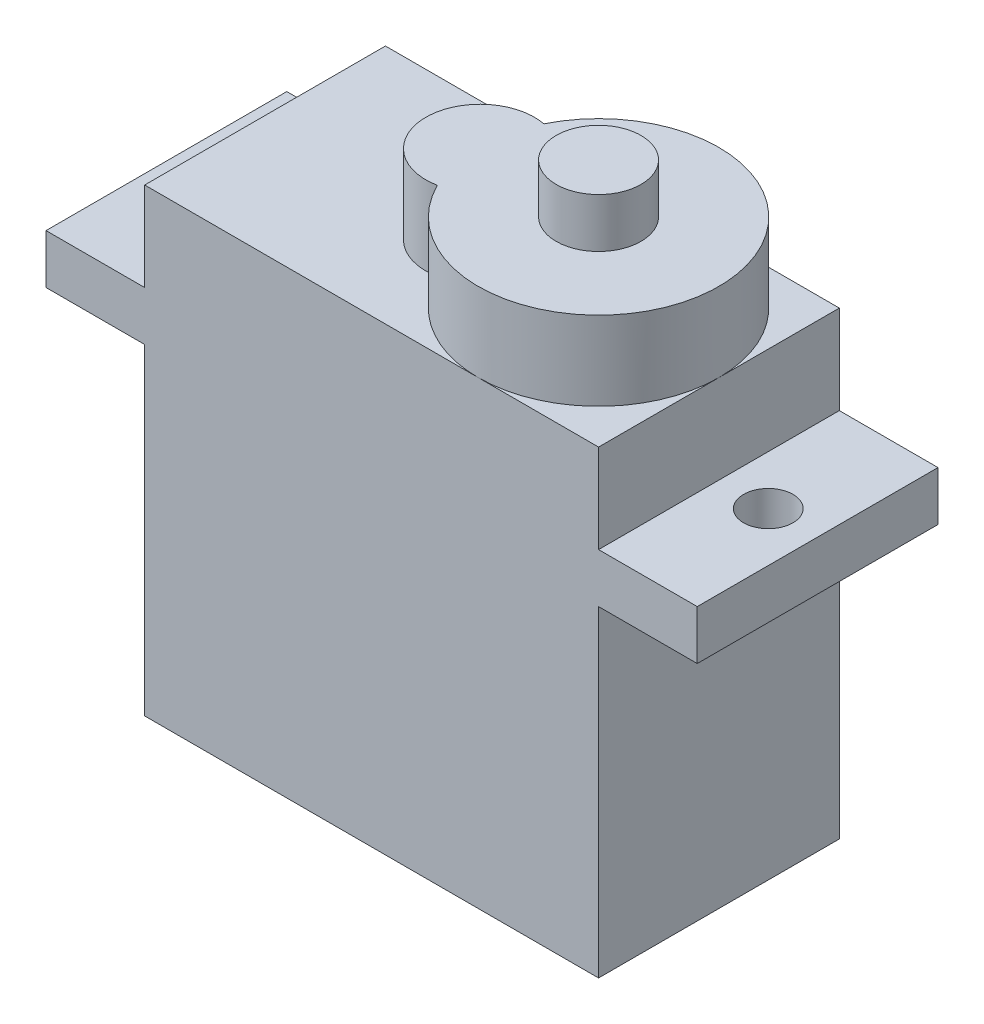
ISO-10303-21;
HEADER;
FILE_DESCRIPTION(('STEP AP214'),'2;1');
FILE_NAME('part.step','',(''),(''),'','','');
FILE_SCHEMA(('AUTOMOTIVE_DESIGN { 1 0 10303 214 1 1 1 1 }'));
ENDSEC;
DATA;
#1=APPLICATION_CONTEXT('core data for automotive mechanical design processes');
#2=APPLICATION_PROTOCOL_DEFINITION('international standard','automotive_design',2000,#1);
#3=PRODUCT_CONTEXT('',#1,'mechanical');
#4=PRODUCT('Part','Part','',(#3));
#5=PRODUCT_RELATED_PRODUCT_CATEGORY('part','',(#4));
#6=PRODUCT_DEFINITION_FORMATION('','',#4);
#7=PRODUCT_DEFINITION_CONTEXT('part definition',#1,'design');
#8=PRODUCT_DEFINITION('design','',#6,#7);
#9=PRODUCT_DEFINITION_SHAPE('','',#8);
#10=(LENGTH_UNIT() NAMED_UNIT(*) SI_UNIT(.MILLI.,.METRE.));
#11=(NAMED_UNIT(*) PLANE_ANGLE_UNIT() SI_UNIT($,.RADIAN.));
#12=(NAMED_UNIT(*) SI_UNIT($,.STERADIAN.) SOLID_ANGLE_UNIT());
#13=UNCERTAINTY_MEASURE_WITH_UNIT(LENGTH_MEASURE(1.E-05),#10,'distance_accuracy_value','');
#14=(GEOMETRIC_REPRESENTATION_CONTEXT(3) GLOBAL_UNCERTAINTY_ASSIGNED_CONTEXT((#13)) GLOBAL_UNIT_ASSIGNED_CONTEXT((#10,
#11,#12)) REPRESENTATION_CONTEXT('',''));
#15=CARTESIAN_POINT('',(0.,0.,0.));
#16=DIRECTION('',(0.,0.,1.));
#17=DIRECTION('',(1.,0.,0.));
#18=AXIS2_PLACEMENT_3D('',#15,#16,#17);
#19=CARTESIAN_POINT('',(0.,23.3,0.));
#20=DIRECTION('',(0.,-1.,0.));
#21=DIRECTION('',(0.,0.,-1.));
#22=AXIS2_PLACEMENT_3D('',#19,#20,#21);
#23=PLANE('',#22);
#24=CARTESIAN_POINT('',(5.4,23.3,0.));
#25=DIRECTION('',(0.,1.,0.));
#26=DIRECTION('',(0.,0.,1.));
#27=AXIS2_PLACEMENT_3D('',#24,#25,#26);
#28=CIRCLE('',#27,6.1);
#29=CARTESIAN_POINT('',(-0.0706250000000021,23.3,2.69856667684439));
#30=VERTEX_POINT('',#29);
#31=CARTESIAN_POINT('',(5.4,23.3,6.1));
#32=VERTEX_POINT('',#31);
#33=EDGE_CURVE('E325',#30,#32,#28,.T.);
#34=ORIENTED_EDGE('',*,*,#33,.F.);
#35=CARTESIAN_POINT('',(-0.6,23.3,0.));
#36=DIRECTION('',(0.,1.,0.));
#37=DIRECTION('',(0.,0.,1.));
#38=AXIS2_PLACEMENT_3D('',#35,#36,#37);
#39=CIRCLE('',#38,2.75);
#40=CARTESIAN_POINT('',(-0.0706249999999986,23.3,-2.6985666768444));
#41=VERTEX_POINT('',#40);
#42=EDGE_CURVE('E66',#41,#30,#39,.T.);
#43=ORIENTED_EDGE('',*,*,#42,.F.);
#44=CARTESIAN_POINT('',(5.4,23.3,-6.1));
#45=VERTEX_POINT('',#44);
#46=EDGE_CURVE('E70',#45,#41,#28,.T.);
#47=ORIENTED_EDGE('',*,*,#46,.F.);
#48=DIRECTION('',(-1.,0.,0.));
#49=VECTOR('',#48,1.);
#50=CARTESIAN_POINT('',(11.5,23.3,-6.1));
#51=LINE('',#50,#49);
#52=CARTESIAN_POINT('',(-11.5,23.3,-6.1));
#53=VERTEX_POINT('',#52);
#54=EDGE_CURVE('E258',#45,#53,#51,.T.);
#55=ORIENTED_EDGE('',*,*,#54,.T.);
#56=DIRECTION('',(0.,0.,1.));
#57=VECTOR('',#56,1.);
#58=CARTESIAN_POINT('',(-11.5,23.3,-6.1));
#59=LINE('',#58,#57);
#60=CARTESIAN_POINT('',(-11.5,23.3,6.1));
#61=VERTEX_POINT('',#60);
#62=EDGE_CURVE('E246',#53,#61,#59,.T.);
#63=ORIENTED_EDGE('',*,*,#62,.T.);
#64=DIRECTION('',(1.,0.,0.));
#65=VECTOR('',#64,1.);
#66=CARTESIAN_POINT('',(11.5,23.3,6.1));
#67=LINE('',#66,#65);
#68=EDGE_CURVE('E251',#61,#32,#67,.T.);
#69=ORIENTED_EDGE('',*,*,#68,.T.);
#70=EDGE_LOOP('',(#34,#43,#47,#55,#63,#69));
#71=FACE_BOUND('',#70,.T.);
#72=ADVANCED_FACE('F49',(#71),#23,.F.);
#73=CARTESIAN_POINT('',(11.5,23.3,0.));
#74=VERTEX_POINT('',#73);
#75=EDGE_CURVE('E58',#32,#74,#28,.T.);
#76=ORIENTED_EDGE('',*,*,#75,.F.);
#77=CARTESIAN_POINT('',(11.5,23.3,6.1));
#78=VERTEX_POINT('',#77);
#79=EDGE_CURVE('E249',#32,#78,#67,.T.);
#80=ORIENTED_EDGE('',*,*,#79,.T.);
#81=DIRECTION('',(0.,0.,-1.));
#82=VECTOR('',#81,1.);
#83=CARTESIAN_POINT('',(11.5,23.3,-6.1));
#84=LINE('',#83,#82);
#85=EDGE_CURVE('E255',#78,#74,#84,.T.);
#86=ORIENTED_EDGE('',*,*,#85,.T.);
#87=EDGE_LOOP('',(#76,#80,#86));
#88=FACE_BOUND('',#87,.T.);
#89=ADVANCED_FACE('F332',(#88),#23,.F.);
#90=CARTESIAN_POINT('',(11.5,23.3,-6.1));
#91=DIRECTION('',(-1.,0.,0.));
#92=DIRECTION('',(0.,0.,1.));
#93=AXIS2_PLACEMENT_3D('',#90,#91,#92);
#94=PLANE('',#93);
#95=DIRECTION('',(0.,0.,1.));
#96=VECTOR('',#95,1.);
#97=CARTESIAN_POINT('',(11.5,18.8,6.1));
#98=LINE('',#97,#96);
#99=CARTESIAN_POINT('',(11.5,18.8,-6.1));
#100=VERTEX_POINT('',#99);
#101=CARTESIAN_POINT('',(11.5,18.8,6.1));
#102=VERTEX_POINT('',#101);
#103=EDGE_CURVE('E188',#100,#102,#98,.T.);
#104=ORIENTED_EDGE('',*,*,#103,.F.);
#105=DIRECTION('',(0.,-1.,0.));
#106=VECTOR('',#105,1.);
#107=CARTESIAN_POINT('',(11.5,23.3,-6.1));
#108=LINE('',#107,#106);
#109=CARTESIAN_POINT('',(11.5,23.3,-6.1));
#110=VERTEX_POINT('',#109);
#111=EDGE_CURVE('E277',#110,#100,#108,.T.);
#112=ORIENTED_EDGE('',*,*,#111,.F.);
#113=EDGE_CURVE('E254',#74,#110,#84,.T.);
#114=ORIENTED_EDGE('',*,*,#113,.F.);
#115=ORIENTED_EDGE('',*,*,#85,.F.);
#116=DIRECTION('',(0.,-1.,0.));
#117=VECTOR('',#116,1.);
#118=CARTESIAN_POINT('',(11.5,23.3,6.1));
#119=LINE('',#118,#117);
#120=EDGE_CURVE('E280',#78,#102,#119,.T.);
#121=ORIENTED_EDGE('',*,*,#120,.T.);
#122=EDGE_LOOP('',(#104,#112,#114,#115,#121));
#123=FACE_BOUND('',#122,.T.);
#124=ADVANCED_FACE('F316',(#123),#94,.F.);
#125=CARTESIAN_POINT('',(-11.5,23.3,-6.1));
#126=DIRECTION('',(1.,0.,0.));
#127=DIRECTION('',(0.,0.,-1.));
#128=AXIS2_PLACEMENT_3D('',#125,#126,#127);
#129=PLANE('',#128);
#130=DIRECTION('',(0.,0.,-1.));
#131=VECTOR('',#130,1.);
#132=CARTESIAN_POINT('',(-11.5,18.8,6.1));
#133=LINE('',#132,#131);
#134=CARTESIAN_POINT('',(-11.5,18.8,6.1));
#135=VERTEX_POINT('',#134);
#136=CARTESIAN_POINT('',(-11.5,18.8,-6.1));
#137=VERTEX_POINT('',#136);
#138=EDGE_CURVE('E216',#135,#137,#133,.T.);
#139=ORIENTED_EDGE('',*,*,#138,.F.);
#140=DIRECTION('',(0.,-1.,0.));
#141=VECTOR('',#140,1.);
#142=CARTESIAN_POINT('',(-11.5,23.3,6.1));
#143=LINE('',#142,#141);
#144=EDGE_CURVE('E53',#61,#135,#143,.T.);
#145=ORIENTED_EDGE('',*,*,#144,.F.);
#146=ORIENTED_EDGE('',*,*,#62,.F.);
#147=DIRECTION('',(0.,-1.,0.));
#148=VECTOR('',#147,1.);
#149=CARTESIAN_POINT('',(-11.5,23.3,-6.1));
#150=LINE('',#149,#148);
#151=EDGE_CURVE('E273',#53,#137,#150,.T.);
#152=ORIENTED_EDGE('',*,*,#151,.T.);
#153=EDGE_LOOP('',(#139,#145,#146,#152));
#154=FACE_BOUND('',#153,.T.);
#155=ADVANCED_FACE('F339',(#154),#129,.F.);
#156=CARTESIAN_POINT('',(-11.5,16.3,6.1));
#157=VERTEX_POINT('',#156);
#158=CARTESIAN_POINT('',(-11.5,0.,6.1));
#159=VERTEX_POINT('',#158);
#160=EDGE_CURVE('E282',#157,#159,#143,.T.);
#161=ORIENTED_EDGE('',*,*,#160,.F.);
#162=DIRECTION('',(0.,0.,-1.));
#163=VECTOR('',#162,1.);
#164=CARTESIAN_POINT('',(-11.5,16.3,6.1));
#165=LINE('',#164,#163);
#166=CARTESIAN_POINT('',(-11.5,16.3,-6.1));
#167=VERTEX_POINT('',#166);
#168=EDGE_CURVE('E219',#157,#167,#165,.T.);
#169=ORIENTED_EDGE('',*,*,#168,.T.);
#170=CARTESIAN_POINT('',(-11.5,0.,-6.1));
#171=VERTEX_POINT('',#170);
#172=EDGE_CURVE('E262',#167,#171,#150,.T.);
#173=ORIENTED_EDGE('',*,*,#172,.T.);
#174=DIRECTION('',(0.,0.,1.));
#175=VECTOR('',#174,1.);
#176=CARTESIAN_POINT('',(-11.5,0.,-6.1));
#177=LINE('',#176,#175);
#178=EDGE_CURVE('E244',#171,#159,#177,.T.);
#179=ORIENTED_EDGE('',*,*,#178,.T.);
#180=EDGE_LOOP('',(#161,#169,#173,#179));
#181=FACE_BOUND('',#180,.T.);
#182=ADVANCED_FACE('F51',(#181),#129,.F.);
#183=CARTESIAN_POINT('',(11.5,23.3,6.1));
#184=DIRECTION('',(0.,0.,-1.));
#185=DIRECTION('',(-1.,0.,0.));
#186=AXIS2_PLACEMENT_3D('',#183,#184,#185);
#187=PLANE('',#186);
#188=DIRECTION('',(1.,0.,0.));
#189=VECTOR('',#188,1.);
#190=CARTESIAN_POINT('',(11.5,0.,6.1));
#191=LINE('',#190,#189);
#192=CARTESIAN_POINT('',(11.5,0.,6.1));
#193=VERTEX_POINT('',#192);
#194=EDGE_CURVE('E265',#159,#193,#191,.T.);
#195=ORIENTED_EDGE('',*,*,#194,.T.);
#196=CARTESIAN_POINT('',(11.5,16.3,6.1));
#197=VERTEX_POINT('',#196);
#198=EDGE_CURVE('E279',#197,#193,#119,.T.);
#199=ORIENTED_EDGE('',*,*,#198,.F.);
#200=DIRECTION('',(1.,0.,0.));
#201=VECTOR('',#200,1.);
#202=CARTESIAN_POINT('',(16.5,16.3,6.1));
#203=LINE('',#202,#201);
#204=CARTESIAN_POINT('',(16.5,16.3,6.1));
#205=VERTEX_POINT('',#204);
#206=EDGE_CURVE('E183',#197,#205,#203,.T.);
#207=ORIENTED_EDGE('',*,*,#206,.T.);
#208=DIRECTION('',(0.,1.,0.));
#209=VECTOR('',#208,1.);
#210=CARTESIAN_POINT('',(16.5,16.3,6.1));
#211=LINE('',#210,#209);
#212=CARTESIAN_POINT('',(16.5,18.8,6.1));
#213=VERTEX_POINT('',#212);
#214=EDGE_CURVE('E176',#205,#213,#211,.T.);
#215=ORIENTED_EDGE('',*,*,#214,.T.);
#216=DIRECTION('',(1.,0.,0.));
#217=VECTOR('',#216,1.);
#218=CARTESIAN_POINT('',(16.5,18.8,6.1));
#219=LINE('',#218,#217);
#220=EDGE_CURVE('E185',#102,#213,#219,.T.);
#221=ORIENTED_EDGE('',*,*,#220,.F.);
#222=ORIENTED_EDGE('',*,*,#120,.F.);
#223=ORIENTED_EDGE('',*,*,#79,.F.);
#224=ORIENTED_EDGE('',*,*,#68,.F.);
#225=ORIENTED_EDGE('',*,*,#144,.T.);
#226=DIRECTION('',(1.,0.,0.));
#227=VECTOR('',#226,1.);
#228=CARTESIAN_POINT('',(-16.5,18.8,6.1));
#229=LINE('',#228,#227);
#230=CARTESIAN_POINT('',(-16.5,18.8,6.1));
#231=VERTEX_POINT('',#230);
#232=EDGE_CURVE('E223',#231,#135,#229,.T.);
#233=ORIENTED_EDGE('',*,*,#232,.F.);
#234=DIRECTION('',(0.,1.,0.));
#235=VECTOR('',#234,1.);
#236=CARTESIAN_POINT('',(-16.5,16.3,6.1));
#237=LINE('',#236,#235);
#238=CARTESIAN_POINT('',(-16.5,16.3,6.1));
#239=VERTEX_POINT('',#238);
#240=EDGE_CURVE('E242',#239,#231,#237,.T.);
#241=ORIENTED_EDGE('',*,*,#240,.F.);
#242=DIRECTION('',(1.,0.,0.));
#243=VECTOR('',#242,1.);
#244=CARTESIAN_POINT('',(-16.5,16.3,6.1));
#245=LINE('',#244,#243);
#246=EDGE_CURVE('E229',#239,#157,#245,.T.);
#247=ORIENTED_EDGE('',*,*,#246,.T.);
#248=ORIENTED_EDGE('',*,*,#160,.T.);
#249=EDGE_LOOP('',(#195,#199,#207,#215,#221,#222,#223,#224,#225,#233,#241,#247,#248));
#250=FACE_BOUND('',#249,.T.);
#251=ADVANCED_FACE('F295',(#250),#187,.F.);
#252=CARTESIAN_POINT('',(11.5,16.3,-6.1));
#253=VERTEX_POINT('',#252);
#254=CARTESIAN_POINT('',(11.5,0.,-6.1));
#255=VERTEX_POINT('',#254);
#256=EDGE_CURVE('E276',#253,#255,#108,.T.);
#257=ORIENTED_EDGE('',*,*,#256,.F.);
#258=DIRECTION('',(0.,0.,1.));
#259=VECTOR('',#258,1.);
#260=CARTESIAN_POINT('',(11.5,16.3,6.1));
#261=LINE('',#260,#259);
#262=EDGE_CURVE('E199',#253,#197,#261,.T.);
#263=ORIENTED_EDGE('',*,*,#262,.T.);
#264=ORIENTED_EDGE('',*,*,#198,.T.);
#265=DIRECTION('',(0.,0.,-1.));
#266=VECTOR('',#265,1.);
#267=CARTESIAN_POINT('',(11.5,0.,-6.1));
#268=LINE('',#267,#266);
#269=EDGE_CURVE('E268',#193,#255,#268,.T.);
#270=ORIENTED_EDGE('',*,*,#269,.T.);
#271=EDGE_LOOP('',(#257,#263,#264,#270));
#272=FACE_BOUND('',#271,.T.);
#273=ADVANCED_FACE('F290',(#272),#94,.F.);
#274=CARTESIAN_POINT('',(11.5,23.3,-6.1));
#275=DIRECTION('',(0.,0.,1.));
#276=DIRECTION('',(1.,0.,0.));
#277=AXIS2_PLACEMENT_3D('',#274,#275,#276);
#278=PLANE('',#277);
#279=DIRECTION('',(-1.,0.,0.));
#280=VECTOR('',#279,1.);
#281=CARTESIAN_POINT('',(11.5,0.,-6.1));
#282=LINE('',#281,#280);
#283=EDGE_CURVE('E250',#255,#171,#282,.T.);
#284=ORIENTED_EDGE('',*,*,#283,.T.);
#285=ORIENTED_EDGE('',*,*,#172,.F.);
#286=DIRECTION('',(-1.,0.,0.));
#287=VECTOR('',#286,1.);
#288=CARTESIAN_POINT('',(-11.5,16.3,-6.1));
#289=LINE('',#288,#287);
#290=CARTESIAN_POINT('',(-16.5,16.3,-6.1));
#291=VERTEX_POINT('',#290);
#292=EDGE_CURVE('E222',#167,#291,#289,.T.);
#293=ORIENTED_EDGE('',*,*,#292,.T.);
#294=DIRECTION('',(0.,1.,0.));
#295=VECTOR('',#294,1.);
#296=CARTESIAN_POINT('',(-16.5,16.3,-6.1));
#297=LINE('',#296,#295);
#298=CARTESIAN_POINT('',(-16.5,18.8,-6.1));
#299=VERTEX_POINT('',#298);
#300=EDGE_CURVE('E232',#291,#299,#297,.T.);
#301=ORIENTED_EDGE('',*,*,#300,.T.);
#302=DIRECTION('',(-1.,0.,0.));
#303=VECTOR('',#302,1.);
#304=CARTESIAN_POINT('',(-11.5,18.8,-6.1));
#305=LINE('',#304,#303);
#306=EDGE_CURVE('E235',#137,#299,#305,.T.);
#307=ORIENTED_EDGE('',*,*,#306,.F.);
#308=ORIENTED_EDGE('',*,*,#151,.F.);
#309=ORIENTED_EDGE('',*,*,#54,.F.);
#310=EDGE_CURVE('E259',#110,#45,#51,.T.);
#311=ORIENTED_EDGE('',*,*,#310,.F.);
#312=ORIENTED_EDGE('',*,*,#111,.T.);
#313=DIRECTION('',(-1.,0.,0.));
#314=VECTOR('',#313,1.);
#315=CARTESIAN_POINT('',(11.5,18.8,-6.1));
#316=LINE('',#315,#314);
#317=CARTESIAN_POINT('',(16.5,18.8,-6.1));
#318=VERTEX_POINT('',#317);
#319=EDGE_CURVE('E191',#318,#100,#316,.T.);
#320=ORIENTED_EDGE('',*,*,#319,.F.);
#321=DIRECTION('',(0.,1.,0.));
#322=VECTOR('',#321,1.);
#323=CARTESIAN_POINT('',(16.5,16.3,-6.1));
#324=LINE('',#323,#322);
#325=CARTESIAN_POINT('',(16.5,16.3,-6.1));
#326=VERTEX_POINT('',#325);
#327=EDGE_CURVE('E178',#326,#318,#324,.T.);
#328=ORIENTED_EDGE('',*,*,#327,.F.);
#329=DIRECTION('',(-1.,0.,0.));
#330=VECTOR('',#329,1.);
#331=CARTESIAN_POINT('',(11.5,16.3,-6.1));
#332=LINE('',#331,#330);
#333=EDGE_CURVE('E202',#326,#253,#332,.T.);
#334=ORIENTED_EDGE('',*,*,#333,.T.);
#335=ORIENTED_EDGE('',*,*,#256,.T.);
#336=EDGE_LOOP('',(#284,#285,#293,#301,#307,#308,#309,#311,#312,#320,#328,#334,#335));
#337=FACE_BOUND('',#336,.T.);
#338=ADVANCED_FACE('F302',(#337),#278,.F.);
#339=EDGE_CURVE('E322',#74,#45,#28,.T.);
#340=ORIENTED_EDGE('',*,*,#339,.F.);
#341=ORIENTED_EDGE('',*,*,#113,.T.);
#342=ORIENTED_EDGE('',*,*,#310,.T.);
#343=EDGE_LOOP('',(#340,#341,#342));
#344=FACE_BOUND('',#343,.T.);
#345=ADVANCED_FACE('F321',(#344),#23,.F.);
#346=CARTESIAN_POINT('',(0.,0.,0.));
#347=DIRECTION('',(0.,-1.,0.));
#348=DIRECTION('',(0.,0.,-1.));
#349=AXIS2_PLACEMENT_3D('',#346,#347,#348);
#350=PLANE('',#349);
#351=ORIENTED_EDGE('',*,*,#178,.F.);
#352=ORIENTED_EDGE('',*,*,#283,.F.);
#353=ORIENTED_EDGE('',*,*,#269,.F.);
#354=ORIENTED_EDGE('',*,*,#194,.F.);
#355=EDGE_LOOP('',(#351,#352,#353,#354));
#356=FACE_BOUND('',#355,.T.);
#357=ADVANCED_FACE('F299',(#356),#350,.T.);
#358=CARTESIAN_POINT('',(-16.5,16.3,-6.1));
#359=DIRECTION('',(-1.,0.,0.));
#360=DIRECTION('',(0.,0.,1.));
#361=AXIS2_PLACEMENT_3D('',#358,#359,#360);
#362=PLANE('',#361);
#363=DIRECTION('',(0.,0.,1.));
#364=VECTOR('',#363,1.);
#365=CARTESIAN_POINT('',(-16.5,18.8,-6.1));
#366=LINE('',#365,#364);
#367=EDGE_CURVE('E238',#299,#231,#366,.T.);
#368=ORIENTED_EDGE('',*,*,#367,.F.);
#369=ORIENTED_EDGE('',*,*,#300,.F.);
#370=DIRECTION('',(0.,0.,1.));
#371=VECTOR('',#370,1.);
#372=CARTESIAN_POINT('',(-16.5,16.3,-6.1));
#373=LINE('',#372,#371);
#374=EDGE_CURVE('E226',#291,#239,#373,.T.);
#375=ORIENTED_EDGE('',*,*,#374,.T.);
#376=ORIENTED_EDGE('',*,*,#240,.T.);
#377=EDGE_LOOP('',(#368,#369,#375,#376));
#378=FACE_BOUND('',#377,.T.);
#379=ADVANCED_FACE('F349',(#378),#362,.T.);
#380=CARTESIAN_POINT('',(0.,16.3,0.));
#381=DIRECTION('',(0.,1.,0.));
#382=DIRECTION('',(0.,0.,1.));
#383=AXIS2_PLACEMENT_3D('',#380,#381,#382);
#384=PLANE('',#383);
#385=CARTESIAN_POINT('',(-14.,16.3,0.));
#386=DIRECTION('',(0.,1.,0.));
#387=DIRECTION('',(0.,0.,1.));
#388=AXIS2_PLACEMENT_3D('',#385,#386,#387);
#389=CIRCLE('',#388,1.25);
#390=CARTESIAN_POINT('',(-14.,16.3,1.25));
#391=VERTEX_POINT('',#390);
#392=EDGE_CURVE('E213',#391,#391,#389,.T.);
#393=ORIENTED_EDGE('',*,*,#392,.T.);
#394=EDGE_LOOP('',(#393));
#395=FACE_BOUND('',#394,.T.);
#396=ORIENTED_EDGE('',*,*,#168,.F.);
#397=ORIENTED_EDGE('',*,*,#246,.F.);
#398=ORIENTED_EDGE('',*,*,#374,.F.);
#399=ORIENTED_EDGE('',*,*,#292,.F.);
#400=EDGE_LOOP('',(#396,#397,#398,#399));
#401=FACE_BOUND('',#400,.T.);
#402=ADVANCED_FACE('F365',(#395,#401),#384,.F.);
#403=CARTESIAN_POINT('',(0.,18.8,0.));
#404=DIRECTION('',(0.,1.,0.));
#405=DIRECTION('',(0.,0.,1.));
#406=AXIS2_PLACEMENT_3D('',#403,#404,#405);
#407=PLANE('',#406);
#408=CARTESIAN_POINT('',(-14.,18.8,0.));
#409=DIRECTION('',(0.,1.,0.));
#410=DIRECTION('',(0.,0.,1.));
#411=AXIS2_PLACEMENT_3D('',#408,#409,#410);
#412=CIRCLE('',#411,1.25);
#413=CARTESIAN_POINT('',(-14.,18.8,1.25));
#414=VERTEX_POINT('',#413);
#415=EDGE_CURVE('E210',#414,#414,#412,.T.);
#416=ORIENTED_EDGE('',*,*,#415,.F.);
#417=EDGE_LOOP('',(#416));
#418=FACE_BOUND('',#417,.T.);
#419=ORIENTED_EDGE('',*,*,#138,.T.);
#420=ORIENTED_EDGE('',*,*,#306,.T.);
#421=ORIENTED_EDGE('',*,*,#367,.T.);
#422=ORIENTED_EDGE('',*,*,#232,.T.);
#423=EDGE_LOOP('',(#419,#420,#421,#422));
#424=FACE_BOUND('',#423,.T.);
#425=ADVANCED_FACE('F370',(#418,#424),#407,.T.);
#426=CARTESIAN_POINT('',(-14.,16.3,0.));
#427=DIRECTION('',(0.,1.,0.));
#428=DIRECTION('',(0.,0.,1.));
#429=AXIS2_PLACEMENT_3D('',#426,#427,#428);
#430=CYLINDRICAL_SURFACE('',#429,1.25);
#431=ORIENTED_EDGE('',*,*,#392,.F.);
#432=EDGE_LOOP('',(#431));
#433=FACE_BOUND('',#432,.T.);
#434=ORIENTED_EDGE('',*,*,#415,.T.);
#435=EDGE_LOOP('',(#434));
#436=FACE_BOUND('',#435,.T.);
#437=ADVANCED_FACE('F373',(#433,#436),#430,.F.);
#438=CARTESIAN_POINT('',(16.5,16.3,-6.1));
#439=DIRECTION('',(1.,0.,0.));
#440=DIRECTION('',(0.,0.,-1.));
#441=AXIS2_PLACEMENT_3D('',#438,#439,#440);
#442=PLANE('',#441);
#443=DIRECTION('',(0.,0.,-1.));
#444=VECTOR('',#443,1.);
#445=CARTESIAN_POINT('',(16.5,18.8,-6.1));
#446=LINE('',#445,#444);
#447=EDGE_CURVE('E193',#213,#318,#446,.T.);
#448=ORIENTED_EDGE('',*,*,#447,.F.);
#449=ORIENTED_EDGE('',*,*,#214,.F.);
#450=DIRECTION('',(0.,0.,-1.));
#451=VECTOR('',#450,1.);
#452=CARTESIAN_POINT('',(16.5,16.3,-6.1));
#453=LINE('',#452,#451);
#454=EDGE_CURVE('E189',#205,#326,#453,.T.);
#455=ORIENTED_EDGE('',*,*,#454,.T.);
#456=ORIENTED_EDGE('',*,*,#327,.T.);
#457=EDGE_LOOP('',(#448,#449,#455,#456));
#458=FACE_BOUND('',#457,.T.);
#459=ADVANCED_FACE('F310',(#458),#442,.T.);
#460=CARTESIAN_POINT('',(0.,16.3,0.));
#461=DIRECTION('',(0.,-1.,0.));
#462=DIRECTION('',(0.,0.,-1.));
#463=AXIS2_PLACEMENT_3D('',#460,#461,#462);
#464=PLANE('',#463);
#465=CARTESIAN_POINT('',(14.,16.3,0.));
#466=DIRECTION('',(0.,1.,0.));
#467=DIRECTION('',(0.,0.,-1.));
#468=AXIS2_PLACEMENT_3D('',#465,#466,#467);
#469=CIRCLE('',#468,1.25);
#470=CARTESIAN_POINT('',(14.,16.3,-1.25));
#471=VERTEX_POINT('',#470);
#472=EDGE_CURVE('E196',#471,#471,#469,.T.);
#473=ORIENTED_EDGE('',*,*,#472,.T.);
#474=EDGE_LOOP('',(#473));
#475=FACE_BOUND('',#474,.T.);
#476=ORIENTED_EDGE('',*,*,#454,.F.);
#477=ORIENTED_EDGE('',*,*,#206,.F.);
#478=ORIENTED_EDGE('',*,*,#262,.F.);
#479=ORIENTED_EDGE('',*,*,#333,.F.);
#480=EDGE_LOOP('',(#476,#477,#478,#479));
#481=FACE_BOUND('',#480,.T.);
#482=ADVANCED_FACE('F307',(#475,#481),#464,.T.);
#483=CARTESIAN_POINT('',(0.,18.8,0.));
#484=DIRECTION('',(0.,-1.,0.));
#485=DIRECTION('',(0.,0.,-1.));
#486=AXIS2_PLACEMENT_3D('',#483,#484,#485);
#487=PLANE('',#486);
#488=CARTESIAN_POINT('',(14.,18.8,0.));
#489=DIRECTION('',(0.,1.,0.));
#490=DIRECTION('',(0.,0.,-1.));
#491=AXIS2_PLACEMENT_3D('',#488,#489,#490);
#492=CIRCLE('',#491,1.25);
#493=CARTESIAN_POINT('',(14.,18.8,-1.25));
#494=VERTEX_POINT('',#493);
#495=EDGE_CURVE('E207',#494,#494,#492,.T.);
#496=ORIENTED_EDGE('',*,*,#495,.F.);
#497=EDGE_LOOP('',(#496));
#498=FACE_BOUND('',#497,.T.);
#499=ORIENTED_EDGE('',*,*,#447,.T.);
#500=ORIENTED_EDGE('',*,*,#319,.T.);
#501=ORIENTED_EDGE('',*,*,#103,.T.);
#502=ORIENTED_EDGE('',*,*,#220,.T.);
#503=EDGE_LOOP('',(#499,#500,#501,#502));
#504=FACE_BOUND('',#503,.T.);
#505=ADVANCED_FACE('F314',(#498,#504),#487,.F.);
#506=CARTESIAN_POINT('',(14.,16.3,0.));
#507=DIRECTION('',(0.,1.,0.));
#508=DIRECTION('',(0.,0.,1.));
#509=AXIS2_PLACEMENT_3D('',#506,#507,#508);
#510=CYLINDRICAL_SURFACE('',#509,1.25);
#511=ORIENTED_EDGE('',*,*,#472,.F.);
#512=EDGE_LOOP('',(#511));
#513=FACE_BOUND('',#512,.T.);
#514=ORIENTED_EDGE('',*,*,#495,.T.);
#515=EDGE_LOOP('',(#514));
#516=FACE_BOUND('',#515,.T.);
#517=ADVANCED_FACE('F432',(#513,#516),#510,.F.);
#518=CARTESIAN_POINT('',(5.4,27.3,0.));
#519=DIRECTION('',(0.,-1.,0.));
#520=DIRECTION('',(0.,0.,-1.));
#521=AXIS2_PLACEMENT_3D('',#518,#519,#520);
#522=CYLINDRICAL_SURFACE('',#521,6.1);
#523=ORIENTED_EDGE('',*,*,#33,.T.);
#524=ORIENTED_EDGE('',*,*,#75,.T.);
#525=ORIENTED_EDGE('',*,*,#339,.T.);
#526=ORIENTED_EDGE('',*,*,#46,.T.);
#527=DIRECTION('',(0.,-1.,0.));
#528=VECTOR('',#527,1.);
#529=CARTESIAN_POINT('',(-0.0706249999999986,27.3,-2.6985666768444));
#530=LINE('',#529,#528);
#531=CARTESIAN_POINT('',(-0.0706249999999986,27.3,-2.6985666768444));
#532=VERTEX_POINT('',#531);
#533=EDGE_CURVE('E163',#532,#41,#530,.T.);
#534=ORIENTED_EDGE('',*,*,#533,.F.);
#535=CARTESIAN_POINT('',(5.4,27.3,0.));
#536=DIRECTION('',(0.,1.,0.));
#537=DIRECTION('',(0.,0.,1.));
#538=AXIS2_PLACEMENT_3D('',#535,#536,#537);
#539=CIRCLE('',#538,6.1);
#540=CARTESIAN_POINT('',(-0.0706250000000021,27.3,2.69856667684439));
#541=VERTEX_POINT('',#540);
#542=EDGE_CURVE('E168',#541,#532,#539,.T.);
#543=ORIENTED_EDGE('',*,*,#542,.F.);
#544=DIRECTION('',(0.,-1.,0.));
#545=VECTOR('',#544,1.);
#546=CARTESIAN_POINT('',(-0.0706250000000021,27.3,2.69856667684439));
#547=LINE('',#546,#545);
#548=EDGE_CURVE('E165',#541,#30,#547,.T.);
#549=ORIENTED_EDGE('',*,*,#548,.T.);
#550=EDGE_LOOP('',(#523,#524,#525,#526,#534,#543,#549));
#551=FACE_BOUND('',#550,.T.);
#552=ADVANCED_FACE('F174',(#551),#522,.T.);
#553=CARTESIAN_POINT('',(-0.6,27.3,0.));
#554=DIRECTION('',(0.,-1.,0.));
#555=DIRECTION('',(0.,0.,-1.));
#556=AXIS2_PLACEMENT_3D('',#553,#554,#555);
#557=CYLINDRICAL_SURFACE('',#556,2.75);
#558=ORIENTED_EDGE('',*,*,#42,.T.);
#559=ORIENTED_EDGE('',*,*,#548,.F.);
#560=CARTESIAN_POINT('',(-0.6,27.3,0.));
#561=DIRECTION('',(0.,1.,0.));
#562=DIRECTION('',(0.,0.,1.));
#563=AXIS2_PLACEMENT_3D('',#560,#561,#562);
#564=CIRCLE('',#563,2.75);
#565=EDGE_CURVE('E159',#532,#541,#564,.T.);
#566=ORIENTED_EDGE('',*,*,#565,.F.);
#567=ORIENTED_EDGE('',*,*,#533,.T.);
#568=EDGE_LOOP('',(#558,#559,#566,#567));
#569=FACE_BOUND('',#568,.T.);
#570=ADVANCED_FACE('F161',(#569),#557,.T.);
#571=CARTESIAN_POINT('',(0.,27.3,0.));
#572=DIRECTION('',(0.,1.,0.));
#573=DIRECTION('',(0.,0.,1.));
#574=AXIS2_PLACEMENT_3D('',#571,#572,#573);
#575=PLANE('',#574);
#576=CARTESIAN_POINT('',(5.4,27.3,0.));
#577=DIRECTION('',(0.,1.,0.));
#578=DIRECTION('',(0.,0.,1.));
#579=AXIS2_PLACEMENT_3D('',#576,#577,#578);
#580=CIRCLE('',#579,2.15);
#581=CARTESIAN_POINT('',(5.4,27.3,2.15));
#582=VERTEX_POINT('',#581);
#583=EDGE_CURVE('E11',#582,#582,#580,.T.);
#584=ORIENTED_EDGE('',*,*,#583,.F.);
#585=EDGE_LOOP('',(#584));
#586=FACE_BOUND('',#585,.T.);
#587=ORIENTED_EDGE('',*,*,#542,.T.);
#588=ORIENTED_EDGE('',*,*,#565,.T.);
#589=EDGE_LOOP('',(#587,#588));
#590=FACE_BOUND('',#589,.T.);
#591=ADVANCED_FACE('F170',(#586,#590),#575,.T.);
#592=CARTESIAN_POINT('',(5.4,29.8,0.));
#593=DIRECTION('',(0.,-1.,0.));
#594=DIRECTION('',(0.,0.,-1.));
#595=AXIS2_PLACEMENT_3D('',#592,#593,#594);
#596=CYLINDRICAL_SURFACE('',#595,2.15);
#597=CARTESIAN_POINT('',(5.4,29.8,0.));
#598=DIRECTION('',(0.,1.,0.));
#599=DIRECTION('',(0.,0.,1.));
#600=AXIS2_PLACEMENT_3D('',#597,#598,#599);
#601=CIRCLE('',#600,2.15);
#602=CARTESIAN_POINT('',(5.4,29.8,2.15));
#603=VERTEX_POINT('',#602);
#604=EDGE_CURVE('E326',#603,#603,#601,.T.);
#605=ORIENTED_EDGE('',*,*,#604,.F.);
#606=EDGE_LOOP('',(#605));
#607=FACE_BOUND('',#606,.T.);
#608=ORIENTED_EDGE('',*,*,#583,.T.);
#609=EDGE_LOOP('',(#608));
#610=FACE_BOUND('',#609,.T.);
#611=ADVANCED_FACE('F476',(#607,#610),#596,.T.);
#612=CARTESIAN_POINT('',(5.4,29.8,0.));
#613=DIRECTION('',(0.,1.,0.));
#614=DIRECTION('',(0.,0.,1.));
#615=AXIS2_PLACEMENT_3D('',#612,#613,#614);
#616=PLANE('',#615);
#617=ORIENTED_EDGE('',*,*,#604,.T.);
#618=EDGE_LOOP('',(#617));
#619=FACE_BOUND('',#618,.T.);
#620=ADVANCED_FACE('F487',(#619),#616,.T.);
#621=CLOSED_SHELL('',(#72,#89,#124,#155,#182,#251,#273,#338,#345,#357,#379,#402,#425,#437,#459,
#482,#505,#517,#552,#570,#591,#611,#620));
#622=MANIFOLD_SOLID_BREP('B2',#621);
#623=ADVANCED_BREP_SHAPE_REPRESENTATION('',(#18,#622),#14);
#624=SHAPE_DEFINITION_REPRESENTATION(#9,#623);
ENDSEC;
END-ISO-10303-21;
